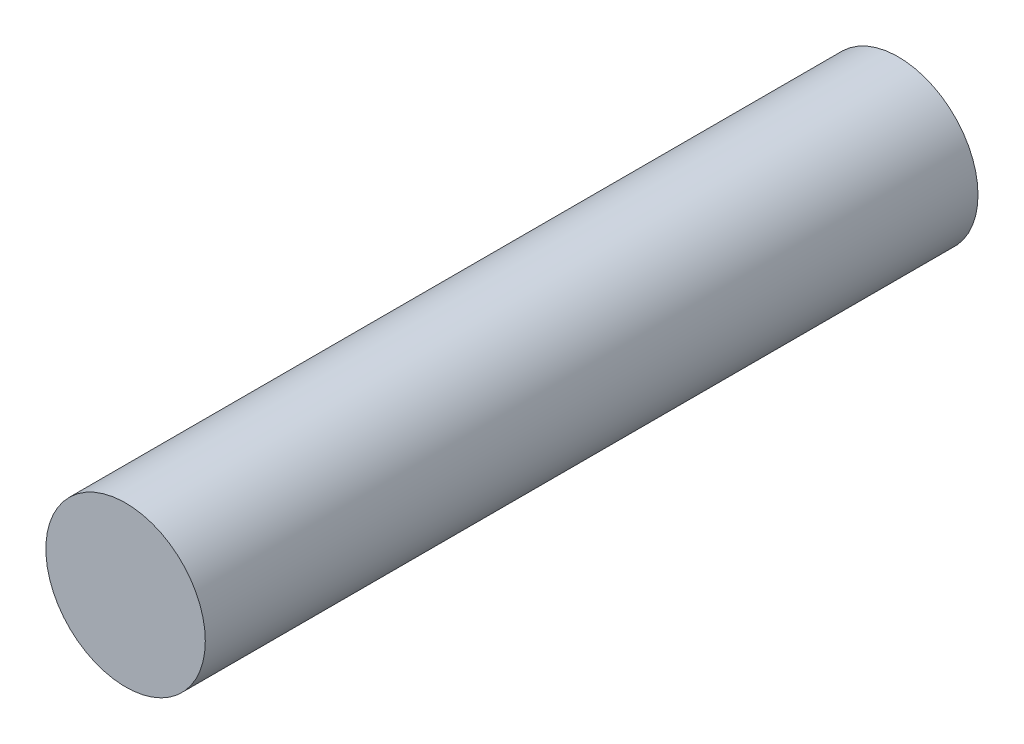
ISO-10303-21;
HEADER;
FILE_DESCRIPTION(('STEP AP214'),'2;1');
FILE_NAME('part.step','',(''),(''),'','','');
FILE_SCHEMA(('AUTOMOTIVE_DESIGN { 1 0 10303 214 1 1 1 1 }'));
ENDSEC;
DATA;
#1=APPLICATION_CONTEXT('core data for automotive mechanical design processes');
#2=APPLICATION_PROTOCOL_DEFINITION('international standard','automotive_design',2000,#1);
#3=PRODUCT_CONTEXT('',#1,'mechanical');
#4=PRODUCT('Part','Part','',(#3));
#5=PRODUCT_RELATED_PRODUCT_CATEGORY('part','',(#4));
#6=PRODUCT_DEFINITION_FORMATION('','',#4);
#7=PRODUCT_DEFINITION_CONTEXT('part definition',#1,'design');
#8=PRODUCT_DEFINITION('design','',#6,#7);
#9=PRODUCT_DEFINITION_SHAPE('','',#8);
#10=(LENGTH_UNIT() NAMED_UNIT(*) SI_UNIT(.MILLI.,.METRE.));
#11=(NAMED_UNIT(*) PLANE_ANGLE_UNIT() SI_UNIT($,.RADIAN.));
#12=(NAMED_UNIT(*) SI_UNIT($,.STERADIAN.) SOLID_ANGLE_UNIT());
#13=UNCERTAINTY_MEASURE_WITH_UNIT(LENGTH_MEASURE(1.E-05),#10,'distance_accuracy_value','');
#14=(GEOMETRIC_REPRESENTATION_CONTEXT(3) GLOBAL_UNCERTAINTY_ASSIGNED_CONTEXT((#13)) GLOBAL_UNIT_ASSIGNED_CONTEXT((#10,
#11,#12)) REPRESENTATION_CONTEXT('',''));
#15=CARTESIAN_POINT('',(0.,0.,0.));
#16=DIRECTION('',(0.,0.,1.));
#17=DIRECTION('',(1.,0.,0.));
#18=AXIS2_PLACEMENT_3D('',#15,#16,#17);
#19=CARTESIAN_POINT('',(0.,0.,16.));
#20=DIRECTION('',(0.,0.,-1.));
#21=DIRECTION('',(-1.,0.,0.));
#22=AXIS2_PLACEMENT_3D('',#19,#20,#21);
#23=CYLINDRICAL_SURFACE('',#22,1.651);
#24=CARTESIAN_POINT('',(0.,0.,16.));
#25=DIRECTION('',(0.,0.,1.));
#26=DIRECTION('',(1.,0.,0.));
#27=AXIS2_PLACEMENT_3D('',#24,#25,#26);
#28=CIRCLE('',#27,1.651);
#29=CARTESIAN_POINT('',(1.651,0.,16.));
#30=VERTEX_POINT('',#29);
#31=EDGE_CURVE('E10',#30,#30,#28,.T.);
#32=ORIENTED_EDGE('',*,*,#31,.F.);
#33=EDGE_LOOP('',(#32));
#34=FACE_BOUND('',#33,.T.);
#35=CARTESIAN_POINT('',(0.,0.,0.));
#36=DIRECTION('',(0.,0.,1.));
#37=DIRECTION('',(1.,0.,0.));
#38=AXIS2_PLACEMENT_3D('',#35,#36,#37);
#39=CIRCLE('',#38,1.651);
#40=CARTESIAN_POINT('',(1.651,0.,0.));
#41=VERTEX_POINT('',#40);
#42=EDGE_CURVE('E35',#41,#41,#39,.T.);
#43=ORIENTED_EDGE('',*,*,#42,.T.);
#44=EDGE_LOOP('',(#43));
#45=FACE_BOUND('',#44,.T.);
#46=ADVANCED_FACE('F32',(#34,#45),#23,.T.);
#47=CARTESIAN_POINT('',(0.,0.,16.));
#48=DIRECTION('',(0.,0.,1.));
#49=DIRECTION('',(1.,0.,0.));
#50=AXIS2_PLACEMENT_3D('',#47,#48,#49);
#51=PLANE('',#50);
#52=ORIENTED_EDGE('',*,*,#31,.T.);
#53=EDGE_LOOP('',(#52));
#54=FACE_BOUND('',#53,.T.);
#55=ADVANCED_FACE('F47',(#54),#51,.T.);
#56=CARTESIAN_POINT('',(0.,0.,0.));
#57=DIRECTION('',(0.,0.,1.));
#58=DIRECTION('',(1.,0.,0.));
#59=AXIS2_PLACEMENT_3D('',#56,#57,#58);
#60=PLANE('',#59);
#61=ORIENTED_EDGE('',*,*,#42,.F.);
#62=EDGE_LOOP('',(#61));
#63=FACE_BOUND('',#62,.T.);
#64=ADVANCED_FACE('F45',(#63),#60,.F.);
#65=CLOSED_SHELL('',(#46,#55,#64));
#66=MANIFOLD_SOLID_BREP('B2',#65);
#67=ADVANCED_BREP_SHAPE_REPRESENTATION('',(#18,#66),#14);
#68=SHAPE_DEFINITION_REPRESENTATION(#9,#67);
ENDSEC;
END-ISO-10303-21;
